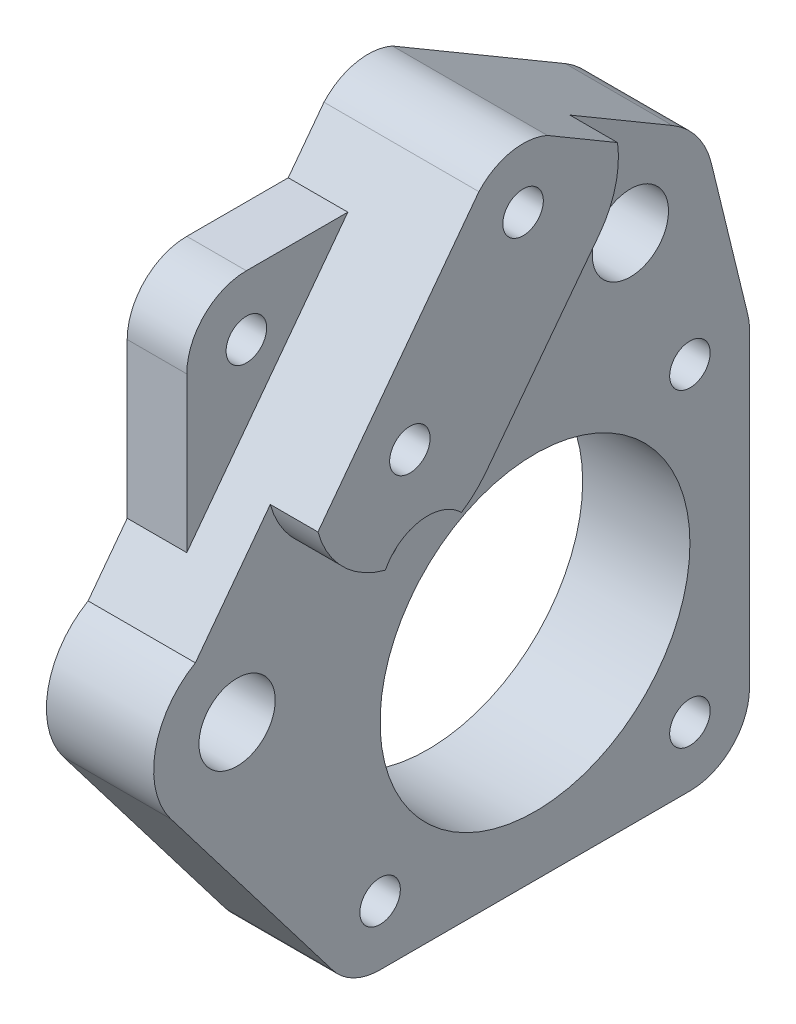
ISO-10303-21;
HEADER;
FILE_DESCRIPTION(('STEP AP214'),'2;1');
FILE_NAME('part.step','',(''),(''),'','','');
FILE_SCHEMA(('AUTOMOTIVE_DESIGN { 1 0 10303 214 1 1 1 1 }'));
ENDSEC;
DATA;
#1=APPLICATION_CONTEXT('core data for automotive mechanical design processes');
#2=APPLICATION_PROTOCOL_DEFINITION('international standard','automotive_design',2000,#1);
#3=PRODUCT_CONTEXT('',#1,'mechanical');
#4=PRODUCT('Part','Part','',(#3));
#5=PRODUCT_RELATED_PRODUCT_CATEGORY('part','',(#4));
#6=PRODUCT_DEFINITION_FORMATION('','',#4);
#7=PRODUCT_DEFINITION_CONTEXT('part definition',#1,'design');
#8=PRODUCT_DEFINITION('design','',#6,#7);
#9=PRODUCT_DEFINITION_SHAPE('','',#8);
#10=(LENGTH_UNIT() NAMED_UNIT(*) SI_UNIT(.MILLI.,.METRE.));
#11=(NAMED_UNIT(*) PLANE_ANGLE_UNIT() SI_UNIT($,.RADIAN.));
#12=(NAMED_UNIT(*) SI_UNIT($,.STERADIAN.) SOLID_ANGLE_UNIT());
#13=UNCERTAINTY_MEASURE_WITH_UNIT(LENGTH_MEASURE(1.E-05),#10,'distance_accuracy_value','');
#14=(GEOMETRIC_REPRESENTATION_CONTEXT(3) GLOBAL_UNCERTAINTY_ASSIGNED_CONTEXT((#13)) GLOBAL_UNIT_ASSIGNED_CONTEXT((#10,
#11,#12)) REPRESENTATION_CONTEXT('',''));
#15=CARTESIAN_POINT('',(0.,0.,0.));
#16=DIRECTION('',(0.,0.,1.));
#17=DIRECTION('',(1.,0.,0.));
#18=AXIS2_PLACEMENT_3D('',#15,#16,#17);
#19=CARTESIAN_POINT('',(4.,-2.49999999998229,22.4999999999866));
#20=DIRECTION('',(-1.,0.,0.));
#21=DIRECTION('',(0.,0.,1.));
#22=AXIS2_PLACEMENT_3D('',#19,#20,#21);
#23=CYLINDRICAL_SURFACE('',#22,8.);
#24=CARTESIAN_POINT('',(0.,-2.49999999998229,22.4999999999866));
#25=DIRECTION('',(1.,0.,0.));
#26=DIRECTION('',(0.,0.,1.));
#27=AXIS2_PLACEMENT_3D('',#24,#25,#26);
#28=CIRCLE('',#27,8.);
#29=CARTESIAN_POINT('',(0.,-4.62238909359415,30.2133303141452));
#30=VERTEX_POINT('',#29);
#31=CARTESIAN_POINT('',(0.,-10.2300450915513,24.5606801989284));
#32=VERTEX_POINT('',#31);
#33=EDGE_CURVE('E253',#30,#32,#28,.T.);
#34=ORIENTED_EDGE('',*,*,#33,.T.);
#35=DIRECTION('',(1.,0.,0.));
#36=VECTOR('',#35,1.);
#37=CARTESIAN_POINT('',(0.,-10.2300450915513,24.5606801989284));
#38=LINE('',#37,#36);
#39=CARTESIAN_POINT('',(4.,-10.2300450915513,24.5606801989284));
#40=VERTEX_POINT('',#39);
#41=EDGE_CURVE('E225',#32,#40,#38,.T.);
#42=ORIENTED_EDGE('',*,*,#41,.T.);
#43=CARTESIAN_POINT('',(4.,-2.49999999998229,22.4999999999866));
#44=DIRECTION('',(1.,0.,0.));
#45=DIRECTION('',(0.,0.,1.));
#46=AXIS2_PLACEMENT_3D('',#43,#44,#45);
#47=CIRCLE('',#46,8.);
#48=CARTESIAN_POINT('',(4.,-4.62238909359415,30.2133303141452));
#49=VERTEX_POINT('',#48);
#50=EDGE_CURVE('E232',#49,#40,#47,.T.);
#51=ORIENTED_EDGE('',*,*,#50,.F.);
#52=DIRECTION('',(-1.,0.,0.));
#53=VECTOR('',#52,1.);
#54=CARTESIAN_POINT('',(4.,-4.62238909359415,30.2133303141452));
#55=LINE('',#54,#53);
#56=EDGE_CURVE('E248',#49,#30,#55,.T.);
#57=ORIENTED_EDGE('',*,*,#56,.T.);
#58=EDGE_LOOP('',(#34,#42,#51,#57));
#59=FACE_BOUND('',#58,.T.);
#60=ADVANCED_FACE('F32',(#59),#23,.T.);
#61=CARTESIAN_POINT('',(-9.,10.0000000000001,12.9999999999998));
#62=DIRECTION('',(1.,0.,0.));
#63=DIRECTION('',(0.,0.,-1.));
#64=AXIS2_PLACEMENT_3D('',#61,#62,#63);
#65=CYLINDRICAL_SURFACE('',#64,5.);
#66=DIRECTION('',(1.,0.,0.));
#67=VECTOR('',#66,1.);
#68=CARTESIAN_POINT('',(-9.,13.3545666198458,16.7076788956186));
#69=LINE('',#68,#67);
#70=CARTESIAN_POINT('',(-9.,13.3545666198458,16.7076788956186));
#71=VERTEX_POINT('',#70);
#72=CARTESIAN_POINT('',(4.,13.3545666198458,16.7076788956186));
#73=VERTEX_POINT('',#72);
#74=EDGE_CURVE('E293',#71,#73,#69,.T.);
#75=ORIENTED_EDGE('',*,*,#74,.T.);
#76=CARTESIAN_POINT('',(4.,10.0000000000001,12.9999999999998));
#77=DIRECTION('',(1.,0.,0.));
#78=DIRECTION('',(0.,0.,1.));
#79=AXIS2_PLACEMENT_3D('',#76,#77,#78);
#80=CIRCLE('',#79,5.);
#81=CARTESIAN_POINT('',(4.,14.5649291278001,10.9600436136612));
#82=VERTEX_POINT('',#81);
#83=EDGE_CURVE('E243',#82,#73,#80,.T.);
#84=ORIENTED_EDGE('',*,*,#83,.F.);
#85=DIRECTION('',(1.,0.,0.));
#86=VECTOR('',#85,1.);
#87=CARTESIAN_POINT('',(-9.,14.5649291278001,10.9600436136612));
#88=LINE('',#87,#86);
#89=CARTESIAN_POINT('',(-9.,14.5649291278001,10.9600436136612));
#90=VERTEX_POINT('',#89);
#91=EDGE_CURVE('E312',#90,#82,#88,.T.);
#92=ORIENTED_EDGE('',*,*,#91,.F.);
#93=CARTESIAN_POINT('',(-9.,10.0000000000001,12.9999999999998));
#94=DIRECTION('',(1.,0.,0.));
#95=DIRECTION('',(0.,0.,-1.));
#96=AXIS2_PLACEMENT_3D('',#93,#94,#95);
#97=CIRCLE('',#96,5.);
#98=EDGE_CURVE('E191',#90,#71,#97,.T.);
#99=ORIENTED_EDGE('',*,*,#98,.T.);
#100=EDGE_LOOP('',(#75,#84,#92,#99));
#101=FACE_BOUND('',#100,.T.);
#102=ADVANCED_FACE('F384',(#101),#65,.T.);
#103=CARTESIAN_POINT('',(-9.,4.53429443986421,-6.09888088978499));
#104=DIRECTION('',(0.,0.862023127131016,-0.506868945873847));
#105=DIRECTION('',(0.,0.506868945873847,0.862023127131016));
#106=AXIS2_PLACEMENT_3D('',#103,#104,#105);
#107=PLANE('',#106);
#108=DIRECTION('',(0.,0.506868945873847,0.862023127131016));
#109=VECTOR('',#108,1.);
#110=CARTESIAN_POINT('',(0.,4.53429443986421,-6.09888088978499));
#111=LINE('',#110,#109);
#112=CARTESIAN_POINT('',(0.,6.03416188991709,-3.54808262111693));
#113=VERTEX_POINT('',#112);
#114=CARTESIAN_POINT('',(0.,11.1055628691357,5.07676008552106));
#115=VERTEX_POINT('',#114);
#116=EDGE_CURVE('E309',#113,#115,#111,.T.);
#117=ORIENTED_EDGE('',*,*,#116,.F.);
#118=DIRECTION('',(1.,0.,0.));
#119=VECTOR('',#118,1.);
#120=CARTESIAN_POINT('',(-9.,6.03416188991709,-3.54808262111693));
#121=LINE('',#120,#119);
#122=CARTESIAN_POINT('',(-9.,6.03416188991709,-3.54808262111693));
#123=VERTEX_POINT('',#122);
#124=EDGE_CURVE('E40',#113,#123,#121,.F.);
#125=ORIENTED_EDGE('',*,*,#124,.T.);
#126=DIRECTION('',(0.,0.506868945873847,0.862023127131016));
#127=VECTOR('',#126,1.);
#128=CARTESIAN_POINT('',(-9.,4.53429443986421,-6.09888088978499));
#129=LINE('',#128,#127);
#130=EDGE_CURVE('E297',#123,#90,#129,.T.);
#131=ORIENTED_EDGE('',*,*,#130,.T.);
#132=ORIENTED_EDGE('',*,*,#91,.T.);
#133=DIRECTION('',(0.,0.506868945873847,0.862023127131016));
#134=VECTOR('',#133,1.);
#135=CARTESIAN_POINT('',(4.,14.5649291278001,10.9600436136612));
#136=LINE('',#135,#134);
#137=CARTESIAN_POINT('',(4.,11.1055628691357,5.07676008552106));
#138=VERTEX_POINT('',#137);
#139=EDGE_CURVE('E240',#138,#82,#136,.T.);
#140=ORIENTED_EDGE('',*,*,#139,.F.);
#141=DIRECTION('',(-1.,0.,0.));
#142=VECTOR('',#141,1.);
#143=CARTESIAN_POINT('',(4.,11.1055628691357,5.07676008552106));
#144=LINE('',#143,#142);
#145=EDGE_CURVE('E264',#138,#115,#144,.T.);
#146=ORIENTED_EDGE('',*,*,#145,.T.);
#147=EDGE_LOOP('',(#117,#125,#131,#132,#140,#146));
#148=FACE_BOUND('',#147,.T.);
#149=ADVANCED_FACE('F508',(#148),#107,.T.);
#150=CARTESIAN_POINT('',(-9.,-11.4512819041316,-10.));
#151=DIRECTION('',(0.,0.237082259689985,-0.971489579017856));
#152=DIRECTION('',(0.,0.971489579017856,0.237082259689985));
#153=AXIS2_PLACEMENT_3D('',#150,#151,#152);
#154=PLANE('',#153);
#155=DIRECTION('',(0.,0.971489579017856,0.237082259689985));
#156=VECTOR('',#155,1.);
#157=CARTESIAN_POINT('',(-9.,-11.4512819041316,-10.));
#158=LINE('',#157,#156);
#159=CARTESIAN_POINT('',(-9.,-10.8671475848076,-9.85744789508928));
#160=VERTEX_POINT('',#159);
#161=CARTESIAN_POINT('',(-9.,1.65957581782987,-6.800427053125));
#162=VERTEX_POINT('',#161);
#163=EDGE_CURVE('E371',#160,#162,#158,.T.);
#164=ORIENTED_EDGE('',*,*,#163,.T.);
#165=DIRECTION('',(1.,0.,0.));
#166=VECTOR('',#165,1.);
#167=CARTESIAN_POINT('',(-9.,1.65957581782987,-6.800427053125));
#168=LINE('',#167,#166);
#169=CARTESIAN_POINT('',(0.,1.65957581782987,-6.800427053125));
#170=VERTEX_POINT('',#169);
#171=EDGE_CURVE('E317',#162,#170,#168,.T.);
#172=ORIENTED_EDGE('',*,*,#171,.T.);
#173=DIRECTION('',(0.,0.971489579017856,0.237082259689985));
#174=VECTOR('',#173,1.);
#175=CARTESIAN_POINT('',(0.,-11.4512819041316,-10.));
#176=LINE('',#175,#174);
#177=CARTESIAN_POINT('',(0.,-10.8671475848076,-9.85744789508928));
#178=VERTEX_POINT('',#177);
#179=EDGE_CURVE('E307',#178,#170,#176,.T.);
#180=ORIENTED_EDGE('',*,*,#179,.F.);
#181=DIRECTION('',(1.,0.,0.));
#182=VECTOR('',#181,1.);
#183=CARTESIAN_POINT('',(-9.,-10.8671475848076,-9.85744789508928));
#184=LINE('',#183,#182);
#185=EDGE_CURVE('E345',#178,#160,#184,.F.);
#186=ORIENTED_EDGE('',*,*,#185,.T.);
#187=EDGE_LOOP('',(#164,#172,#180,#186));
#188=FACE_BOUND('',#187,.T.);
#189=ADVANCED_FACE('F473',(#188),#154,.T.);
#190=CARTESIAN_POINT('',(-9.,-43.0525588832575,-10.));
#191=DIRECTION('',(0.,0.,-1.));
#192=DIRECTION('',(-1.,0.,0.));
#193=AXIS2_PLACEMENT_3D('',#190,#191,#192);
#194=PLANE('',#193);
#195=DIRECTION('',(0.,1.,0.));
#196=VECTOR('',#195,1.);
#197=CARTESIAN_POINT('',(-9.,-43.0525588832575,-10.));
#198=LINE('',#197,#196);
#199=CARTESIAN_POINT('',(-9.,-38.0525588832575,-10.));
#200=VERTEX_POINT('',#199);
#201=CARTESIAN_POINT('',(-9.,-12.0525588832575,-10.));
#202=VERTEX_POINT('',#201);
#203=EDGE_CURVE('E372',#200,#202,#198,.T.);
#204=ORIENTED_EDGE('',*,*,#203,.T.);
#205=DIRECTION('',(1.,0.,0.));
#206=VECTOR('',#205,1.);
#207=CARTESIAN_POINT('',(-9.,-12.0525588832575,-10.));
#208=LINE('',#207,#206);
#209=CARTESIAN_POINT('',(0.,-12.0525588832575,-10.));
#210=VERTEX_POINT('',#209);
#211=EDGE_CURVE('E349',#202,#210,#208,.T.);
#212=ORIENTED_EDGE('',*,*,#211,.T.);
#213=DIRECTION('',(0.,1.,0.));
#214=VECTOR('',#213,1.);
#215=CARTESIAN_POINT('',(0.,-43.0525588832575,-10.));
#216=LINE('',#215,#214);
#217=CARTESIAN_POINT('',(0.,-38.0525588832575,-10.));
#218=VERTEX_POINT('',#217);
#219=EDGE_CURVE('E304',#218,#210,#216,.T.);
#220=ORIENTED_EDGE('',*,*,#219,.F.);
#221=DIRECTION('',(1.,0.,0.));
#222=VECTOR('',#221,1.);
#223=CARTESIAN_POINT('',(-9.,-38.0525588832575,-10.));
#224=LINE('',#223,#222);
#225=EDGE_CURVE('E355',#218,#200,#224,.F.);
#226=ORIENTED_EDGE('',*,*,#225,.T.);
#227=EDGE_LOOP('',(#204,#212,#220,#226));
#228=FACE_BOUND('',#227,.T.);
#229=ADVANCED_FACE('F481',(#228),#194,.T.);
#230=CARTESIAN_POINT('',(-9.,-43.0525588832575,23.4721498299046));
#231=DIRECTION('',(0.,-1.,0.));
#232=DIRECTION('',(0.,0.,-1.));
#233=AXIS2_PLACEMENT_3D('',#230,#231,#232);
#234=PLANE('',#233);
#235=DIRECTION('',(0.,0.,-1.));
#236=VECTOR('',#235,1.);
#237=CARTESIAN_POINT('',(0.,-43.0525588832575,23.4721498299046));
#238=LINE('',#237,#236);
#239=CARTESIAN_POINT('',(0.,-43.0525588832575,21.));
#240=VERTEX_POINT('',#239);
#241=CARTESIAN_POINT('',(0.,-43.0525588832575,-5.));
#242=VERTEX_POINT('',#241);
#243=EDGE_CURVE('E302',#240,#242,#238,.T.);
#244=ORIENTED_EDGE('',*,*,#243,.F.);
#245=DIRECTION('',(1.,0.,0.));
#246=VECTOR('',#245,1.);
#247=CARTESIAN_POINT('',(-9.,-43.0525588832575,21.));
#248=LINE('',#247,#246);
#249=CARTESIAN_POINT('',(-9.,-43.0525588832575,21.));
#250=VERTEX_POINT('',#249);
#251=EDGE_CURVE('E325',#240,#250,#248,.F.);
#252=ORIENTED_EDGE('',*,*,#251,.T.);
#253=DIRECTION('',(0.,0.,-1.));
#254=VECTOR('',#253,1.);
#255=CARTESIAN_POINT('',(-9.,-43.0525588832575,23.4721498299046));
#256=LINE('',#255,#254);
#257=CARTESIAN_POINT('',(-9.,-43.0525588832575,-5.));
#258=VERTEX_POINT('',#257);
#259=EDGE_CURVE('E375',#250,#258,#256,.T.);
#260=ORIENTED_EDGE('',*,*,#259,.T.);
#261=DIRECTION('',(1.,0.,0.));
#262=VECTOR('',#261,1.);
#263=CARTESIAN_POINT('',(-9.,-43.0525588832575,-5.));
#264=LINE('',#263,#262);
#265=EDGE_CURVE('E358',#258,#242,#264,.T.);
#266=ORIENTED_EDGE('',*,*,#265,.T.);
#267=EDGE_LOOP('',(#244,#252,#260,#266));
#268=FACE_BOUND('',#267,.T.);
#269=ADVANCED_FACE('F501',(#268),#234,.T.);
#270=CARTESIAN_POINT('',(-9.,-23.30240929908,38.5622631583856));
#271=DIRECTION('',(0.,-0.607121487974639,0.794609022626512));
#272=DIRECTION('',(0.,-0.794609022626512,-0.607121487974639));
#273=AXIS2_PLACEMENT_3D('',#270,#271,#272);
#274=PLANE('',#273);
#275=DIRECTION('',(0.,-0.794609022626512,-0.607121487974639));
#276=VECTOR('',#275,1.);
#277=CARTESIAN_POINT('',(-9.,-23.30240929908,38.5622631583856));
#278=LINE('',#277,#276);
#279=CARTESIAN_POINT('',(-9.,-23.30240929908,38.5622631583856));
#280=VERTEX_POINT('',#279);
#281=CARTESIAN_POINT('',(-9.,-41.0881663231307,24.9730451131326));
#282=VERTEX_POINT('',#281);
#283=EDGE_CURVE('E379',#280,#282,#278,.T.);
#284=ORIENTED_EDGE('',*,*,#283,.T.);
#285=DIRECTION('',(1.,0.,0.));
#286=VECTOR('',#285,1.);
#287=CARTESIAN_POINT('',(-9.,-41.0881663231307,24.9730451131326));
#288=LINE('',#287,#286);
#289=CARTESIAN_POINT('',(0.,-41.0881663231307,24.9730451131326));
#290=VERTEX_POINT('',#289);
#291=EDGE_CURVE('E333',#282,#290,#288,.T.);
#292=ORIENTED_EDGE('',*,*,#291,.T.);
#293=DIRECTION('',(0.,-0.794609022626512,-0.607121487974639));
#294=VECTOR('',#293,1.);
#295=CARTESIAN_POINT('',(0.,-23.30240929908,38.5622631583856));
#296=LINE('',#295,#294);
#297=CARTESIAN_POINT('',(0.,-23.30240929908,38.5622631583856));
#298=VERTEX_POINT('',#297);
#299=EDGE_CURVE('E288',#298,#290,#296,.T.);
#300=ORIENTED_EDGE('',*,*,#299,.F.);
#301=DIRECTION('',(1.,0.,0.));
#302=VECTOR('',#301,1.);
#303=CARTESIAN_POINT('',(-9.,-23.30240929908,38.5622631583856));
#304=LINE('',#303,#302);
#305=EDGE_CURVE('E363',#280,#298,#304,.T.);
#306=ORIENTED_EDGE('',*,*,#305,.F.);
#307=EDGE_LOOP('',(#284,#292,#300,#306));
#308=FACE_BOUND('',#307,.T.);
#309=ADVANCED_FACE('F492',(#308),#274,.T.);
#310=CARTESIAN_POINT('',(-9.,-19.0525588832575,33.));
#311=DIRECTION('',(1.,0.,0.));
#312=DIRECTION('',(0.,0.,-1.));
#313=AXIS2_PLACEMENT_3D('',#310,#311,#312);
#314=CYLINDRICAL_SURFACE('',#313,7.);
#315=CARTESIAN_POINT('',(0.,-19.0525588832575,33.));
#316=DIRECTION('',(1.,0.,0.));
#317=DIRECTION('',(0.,0.,-1.));
#318=AXIS2_PLACEMENT_3D('',#315,#316,#317);
#319=CIRCLE('',#318,7.);
#320=CARTESIAN_POINT('',(0.,-12.9903810567664,36.5));
#321=VERTEX_POINT('',#320);
#322=EDGE_CURVE('E286',#321,#298,#319,.T.);
#323=ORIENTED_EDGE('',*,*,#322,.F.);
#324=DIRECTION('',(1.,0.,0.));
#325=VECTOR('',#324,1.);
#326=CARTESIAN_POINT('',(-9.,-12.9903810567664,36.5));
#327=LINE('',#326,#325);
#328=CARTESIAN_POINT('',(-9.,-12.9903810567664,36.5));
#329=VERTEX_POINT('',#328);
#330=EDGE_CURVE('E283',#329,#321,#327,.T.);
#331=ORIENTED_EDGE('',*,*,#330,.F.);
#332=CARTESIAN_POINT('',(-9.,-19.0525588832575,33.));
#333=DIRECTION('',(1.,0.,0.));
#334=DIRECTION('',(0.,0.,-1.));
#335=AXIS2_PLACEMENT_3D('',#332,#333,#334);
#336=CIRCLE('',#335,7.);
#337=EDGE_CURVE('E186',#329,#280,#336,.T.);
#338=ORIENTED_EDGE('',*,*,#337,.T.);
#339=ORIENTED_EDGE('',*,*,#305,.T.);
#340=EDGE_LOOP('',(#323,#331,#338,#339));
#341=FACE_BOUND('',#340,.T.);
#342=ADVANCED_FACE('F493',(#341),#314,.T.);
#343=CARTESIAN_POINT('',(-9.,13.3545666198458,16.7076788956186));
#344=DIRECTION('',(0.,0.600652599426219,0.799510134271309));
#345=DIRECTION('',(0.,-0.799510134271309,0.600652599426219));
#346=AXIS2_PLACEMENT_3D('',#343,#344,#345);
#347=PLANE('',#346);
#348=DIRECTION('',(-1.,0.,0.));
#349=VECTOR('',#348,1.);
#350=CARTESIAN_POINT('',(-4.,-8.62359022945594,33.2193358168434));
#351=LINE('',#350,#349);
#352=CARTESIAN_POINT('',(-4.,-8.62359022945594,33.2193358168434));
#353=VERTEX_POINT('',#352);
#354=CARTESIAN_POINT('',(-9.,-8.62359022945594,33.2193358168434));
#355=VERTEX_POINT('',#354);
#356=EDGE_CURVE('E194',#353,#355,#351,.T.);
#357=ORIENTED_EDGE('',*,*,#356,.T.);
#358=DIRECTION('',(0.,-0.799510134271309,0.600652599426219));
#359=VECTOR('',#358,1.);
#360=CARTESIAN_POINT('',(-9.,13.3545666198458,16.7076788956186));
#361=LINE('',#360,#359);
#362=EDGE_CURVE('E179',#355,#329,#361,.T.);
#363=ORIENTED_EDGE('',*,*,#362,.T.);
#364=ORIENTED_EDGE('',*,*,#330,.T.);
#365=DIRECTION('',(0.,-0.799510134271309,0.600652599426219));
#366=VECTOR('',#365,1.);
#367=CARTESIAN_POINT('',(0.,13.3545666198458,16.7076788956186));
#368=LINE('',#367,#366);
#369=EDGE_CURVE('E282',#30,#321,#368,.T.);
#370=ORIENTED_EDGE('',*,*,#369,.F.);
#371=ORIENTED_EDGE('',*,*,#56,.F.);
#372=DIRECTION('',(0.,-0.799510134271309,0.600652599426219));
#373=VECTOR('',#372,1.);
#374=CARTESIAN_POINT('',(4.,-4.62238909359415,30.2133303141452));
#375=LINE('',#374,#373);
#376=EDGE_CURVE('E246',#73,#49,#375,.T.);
#377=ORIENTED_EDGE('',*,*,#376,.F.);
#378=ORIENTED_EDGE('',*,*,#74,.F.);
#379=CARTESIAN_POINT('',(-9.,9.36339452560893,19.7061498222513));
#380=VERTEX_POINT('',#379);
#381=EDGE_CURVE('E190',#71,#380,#361,.T.);
#382=ORIENTED_EDGE('',*,*,#381,.T.);
#383=DIRECTION('',(-1.,0.,0.));
#384=VECTOR('',#383,1.);
#385=CARTESIAN_POINT('',(-4.,9.36339452560893,19.7061498222513));
#386=LINE('',#385,#384);
#387=CARTESIAN_POINT('',(-4.,9.36339452560893,19.7061498222513));
#388=VERTEX_POINT('',#387);
#389=EDGE_CURVE('E203',#388,#380,#386,.T.);
#390=ORIENTED_EDGE('',*,*,#389,.F.);
#391=DIRECTION('',(0.,-0.799510134271309,0.600652599426219));
#392=VECTOR('',#391,1.);
#393=CARTESIAN_POINT('',(-4.,9.36339452560893,19.7061498222513));
#394=LINE('',#393,#392);
#395=EDGE_CURVE('E198',#388,#353,#394,.T.);
#396=ORIENTED_EDGE('',*,*,#395,.T.);
#397=EDGE_LOOP('',(#357,#363,#364,#370,#371,#377,#378,#382,#390,#396));
#398=FACE_BOUND('',#397,.T.);
#399=ADVANCED_FACE('F195',(#398),#347,.T.);
#400=CARTESIAN_POINT('',(-9.,10.0000000000001,12.9999999999998));
#401=DIRECTION('',(1.,0.,0.));
#402=DIRECTION('',(0.,0.,-1.));
#403=AXIS2_PLACEMENT_3D('',#400,#401,#402);
#404=PLANE('',#403);
#405=CARTESIAN_POINT('',(-9.00000000000001,-19.0525588832575,33.));
#406=DIRECTION('',(1.,0.,0.));
#407=DIRECTION('',(0.,0.,-1.));
#408=AXIS2_PLACEMENT_3D('',#405,#406,#407);
#409=CIRCLE('',#408,3.20000000000001);
#410=CARTESIAN_POINT('',(-9.00000000000001,-19.0525588832575,29.8));
#411=VERTEX_POINT('',#410);
#412=EDGE_CURVE('E447',#411,#411,#409,.T.);
#413=ORIENTED_EDGE('',*,*,#412,.T.);
#414=EDGE_LOOP('',(#413));
#415=FACE_BOUND('',#414,.T.);
#416=CARTESIAN_POINT('',(-9.00000000000001,0.,0.));
#417=DIRECTION('',(1.,0.,0.));
#418=DIRECTION('',(0.,0.,-1.));
#419=AXIS2_PLACEMENT_3D('',#416,#417,#418);
#420=CIRCLE('',#419,3.20000000000001);
#421=CARTESIAN_POINT('',(-9.00000000000001,0.,-3.20000000000001));
#422=VERTEX_POINT('',#421);
#423=EDGE_CURVE('E441',#422,#422,#420,.T.);
#424=ORIENTED_EDGE('',*,*,#423,.T.);
#425=EDGE_LOOP('',(#424));
#426=FACE_BOUND('',#425,.T.);
#427=CARTESIAN_POINT('',(-9.00000000000001,-12.0525588832575,-5.));
#428=DIRECTION('',(1.,0.,0.));
#429=DIRECTION('',(0.,0.,-1.));
#430=AXIS2_PLACEMENT_3D('',#427,#428,#429);
#431=CIRCLE('',#430,1.70000000000001);
#432=CARTESIAN_POINT('',(-9.00000000000001,-12.0525588832575,-6.70000000000001));
#433=VERTEX_POINT('',#432);
#434=EDGE_CURVE('E435',#433,#433,#431,.T.);
#435=ORIENTED_EDGE('',*,*,#434,.T.);
#436=EDGE_LOOP('',(#435));
#437=FACE_BOUND('',#436,.T.);
#438=CARTESIAN_POINT('',(-9.00000000000001,-12.0525588832575,21.));
#439=DIRECTION('',(1.,0.,0.));
#440=DIRECTION('',(0.,0.,-1.));
#441=AXIS2_PLACEMENT_3D('',#438,#439,#440);
#442=CIRCLE('',#441,1.70000000000001);
#443=CARTESIAN_POINT('',(-9.00000000000001,-12.0525588832575,19.3));
#444=VERTEX_POINT('',#443);
#445=EDGE_CURVE('E429',#444,#444,#442,.T.);
#446=ORIENTED_EDGE('',*,*,#445,.T.);
#447=EDGE_LOOP('',(#446));
#448=FACE_BOUND('',#447,.T.);
#449=CARTESIAN_POINT('',(-9.00000000000001,-38.0525588832575,21.));
#450=DIRECTION('',(1.,0.,0.));
#451=DIRECTION('',(0.,0.,-1.));
#452=AXIS2_PLACEMENT_3D('',#449,#450,#451);
#453=CIRCLE('',#452,1.70000000000001);
#454=CARTESIAN_POINT('',(-9.00000000000001,-38.0525588832575,19.3));
#455=VERTEX_POINT('',#454);
#456=EDGE_CURVE('E423',#455,#455,#453,.T.);
#457=ORIENTED_EDGE('',*,*,#456,.T.);
#458=EDGE_LOOP('',(#457));
#459=FACE_BOUND('',#458,.T.);
#460=CARTESIAN_POINT('',(-9.00000000000001,-38.0525588832575,-5.));
#461=DIRECTION('',(1.,0.,0.));
#462=DIRECTION('',(0.,0.,-1.));
#463=AXIS2_PLACEMENT_3D('',#460,#461,#462);
#464=CIRCLE('',#463,1.70000000000001);
#465=CARTESIAN_POINT('',(-9.00000000000001,-38.0525588832575,-6.70000000000002));
#466=VERTEX_POINT('',#465);
#467=EDGE_CURVE('E417',#466,#466,#464,.T.);
#468=ORIENTED_EDGE('',*,*,#467,.T.);
#469=EDGE_LOOP('',(#468));
#470=FACE_BOUND('',#469,.T.);
#471=CARTESIAN_POINT('',(-9.00000000000001,-25.0525588832575,7.99999999999999));
#472=DIRECTION('',(1.,0.,0.));
#473=DIRECTION('',(0.,0.,-1.));
#474=AXIS2_PLACEMENT_3D('',#471,#472,#473);
#475=CIRCLE('',#474,13.);
#476=CARTESIAN_POINT('',(-9.00000000000001,-25.0525588832575,-5.00000000000002));
#477=VERTEX_POINT('',#476);
#478=EDGE_CURVE('E411',#477,#477,#475,.T.);
#479=ORIENTED_EDGE('',*,*,#478,.T.);
#480=EDGE_LOOP('',(#479));
#481=FACE_BOUND('',#480,.T.);
#482=CARTESIAN_POINT('',(-9.00000000000001,-2.5,22.5000000000001));
#483=DIRECTION('',(1.,0.,0.));
#484=DIRECTION('',(0.,0.,-1.));
#485=AXIS2_PLACEMENT_3D('',#482,#483,#484);
#486=CIRCLE('',#485,1.70000000000001);
#487=CARTESIAN_POINT('',(-9.00000000000001,-2.5,20.8000000000001));
#488=VERTEX_POINT('',#487);
#489=EDGE_CURVE('E405',#488,#488,#486,.T.);
#490=ORIENTED_EDGE('',*,*,#489,.T.);
#491=EDGE_LOOP('',(#490));
#492=FACE_BOUND('',#491,.T.);
#493=CARTESIAN_POINT('',(-9.00000000000001,10.0000000000001,12.9999999999998));
#494=DIRECTION('',(1.,0.,0.));
#495=DIRECTION('',(0.,0.,-1.));
#496=AXIS2_PLACEMENT_3D('',#493,#494,#495);
#497=CIRCLE('',#496,1.70000000000001);
#498=CARTESIAN_POINT('',(-9.00000000000001,10.0000000000001,11.2999999999998));
#499=VERTEX_POINT('',#498);
#500=EDGE_CURVE('E399',#499,#499,#497,.T.);
#501=ORIENTED_EDGE('',*,*,#500,.T.);
#502=EDGE_LOOP('',(#501));
#503=FACE_BOUND('',#502,.T.);
#504=CARTESIAN_POINT('',(-9.,4.36339452560892,28.2193358168434));
#505=DIRECTION('',(-1.,0.,0.));
#506=DIRECTION('',(0.,0.,1.));
#507=AXIS2_PLACEMENT_3D('',#504,#505,#506);
#508=CIRCLE('',#507,1.70000000000001);
#509=CARTESIAN_POINT('',(-9.,4.36339452560892,29.9193358168434));
#510=VERTEX_POINT('',#509);
#511=EDGE_CURVE('E215',#510,#510,#508,.T.);
#512=ORIENTED_EDGE('',*,*,#511,.F.);
#513=EDGE_LOOP('',(#512));
#514=FACE_BOUND('',#513,.T.);
#515=ORIENTED_EDGE('',*,*,#130,.F.);
#516=CARTESIAN_POINT('',(-9.,0.,0.));
#517=DIRECTION('',(1.,0.,0.));
#518=DIRECTION('',(0.,0.,-1.));
#519=AXIS2_PLACEMENT_3D('',#516,#517,#518);
#520=CIRCLE('',#519,7.);
#521=EDGE_CURVE('E11',#123,#162,#520,.F.);
#522=ORIENTED_EDGE('',*,*,#521,.T.);
#523=ORIENTED_EDGE('',*,*,#163,.F.);
#524=CARTESIAN_POINT('',(-9.,-12.0525588832575,-5.));
#525=DIRECTION('',(1.,0.,0.));
#526=DIRECTION('',(0.,0.,-1.));
#527=AXIS2_PLACEMENT_3D('',#524,#525,#526);
#528=CIRCLE('',#527,5.);
#529=EDGE_CURVE('E343',#160,#202,#528,.F.);
#530=ORIENTED_EDGE('',*,*,#529,.T.);
#531=ORIENTED_EDGE('',*,*,#203,.F.);
#532=CARTESIAN_POINT('',(-9.,-38.0525588832575,-5.));
#533=DIRECTION('',(1.,0.,0.));
#534=DIRECTION('',(0.,0.,-1.));
#535=AXIS2_PLACEMENT_3D('',#532,#533,#534);
#536=CIRCLE('',#535,5.);
#537=EDGE_CURVE('E352',#200,#258,#536,.F.);
#538=ORIENTED_EDGE('',*,*,#537,.T.);
#539=ORIENTED_EDGE('',*,*,#259,.F.);
#540=CARTESIAN_POINT('',(-9.,-38.0525588832575,21.));
#541=DIRECTION('',(1.,0.,0.));
#542=DIRECTION('',(0.,0.,-1.));
#543=AXIS2_PLACEMENT_3D('',#540,#541,#542);
#544=CIRCLE('',#543,5.);
#545=EDGE_CURVE('E320',#250,#282,#544,.F.);
#546=ORIENTED_EDGE('',*,*,#545,.T.);
#547=ORIENTED_EDGE('',*,*,#283,.F.);
#548=ORIENTED_EDGE('',*,*,#337,.F.);
#549=ORIENTED_EDGE('',*,*,#362,.F.);
#550=DIRECTION('',(0.,1.,0.));
#551=VECTOR('',#550,1.);
#552=CARTESIAN_POINT('',(-9.,-8.62359022945594,33.2193358168434));
#553=LINE('',#552,#551);
#554=CARTESIAN_POINT('',(-9.,4.36339452560892,33.2193358168434));
#555=VERTEX_POINT('',#554);
#556=EDGE_CURVE('E183',#355,#555,#553,.T.);
#557=ORIENTED_EDGE('',*,*,#556,.T.);
#558=CARTESIAN_POINT('',(-9.,4.36339452560892,28.2193358168434));
#559=DIRECTION('',(1.,0.,0.));
#560=DIRECTION('',(0.,0.,-1.));
#561=AXIS2_PLACEMENT_3D('',#558,#559,#560);
#562=CIRCLE('',#561,5.);
#563=CARTESIAN_POINT('',(-9.,9.36339452560892,28.2193358168434));
#564=VERTEX_POINT('',#563);
#565=EDGE_CURVE('E340',#555,#564,#562,.F.);
#566=ORIENTED_EDGE('',*,*,#565,.T.);
#567=DIRECTION('',(0.,0.,-1.));
#568=VECTOR('',#567,1.);
#569=CARTESIAN_POINT('',(-9.,9.36339452560892,33.2193358168434));
#570=LINE('',#569,#568);
#571=EDGE_CURVE('E209',#564,#380,#570,.T.);
#572=ORIENTED_EDGE('',*,*,#571,.T.);
#573=ORIENTED_EDGE('',*,*,#381,.F.);
#574=ORIENTED_EDGE('',*,*,#98,.F.);
#575=EDGE_LOOP('',(#515,#522,#523,#530,#531,#538,#539,#546,#547,#548,#549,#557,#566,#572,#573,#574));
#576=FACE_BOUND('',#575,.T.);
#577=ADVANCED_FACE('F181',(#415,#426,#437,#448,#459,#470,#481,#492,#503,#514,#576),#404,.F.);
#578=CARTESIAN_POINT('',(0.,10.0000000000001,12.9999999999998));
#579=DIRECTION('',(1.,0.,0.));
#580=DIRECTION('',(0.,0.,-1.));
#581=AXIS2_PLACEMENT_3D('',#578,#579,#580);
#582=PLANE('',#581);
#583=CARTESIAN_POINT('',(0.,-19.0525588832575,33.));
#584=DIRECTION('',(1.,0.,0.));
#585=DIRECTION('',(0.,0.,-1.));
#586=AXIS2_PLACEMENT_3D('',#583,#584,#585);
#587=CIRCLE('',#586,3.20000000000002);
#588=CARTESIAN_POINT('',(0.,-19.0525588832575,29.8));
#589=VERTEX_POINT('',#588);
#590=EDGE_CURVE('E450',#589,#589,#587,.T.);
#591=ORIENTED_EDGE('',*,*,#590,.F.);
#592=EDGE_LOOP('',(#591));
#593=FACE_BOUND('',#592,.T.);
#594=CARTESIAN_POINT('',(0.,0.,0.));
#595=DIRECTION('',(1.,0.,0.));
#596=DIRECTION('',(0.,0.,-1.));
#597=AXIS2_PLACEMENT_3D('',#594,#595,#596);
#598=CIRCLE('',#597,3.20000000000001);
#599=CARTESIAN_POINT('',(0.,0.,-3.20000000000001));
#600=VERTEX_POINT('',#599);
#601=EDGE_CURVE('E444',#600,#600,#598,.T.);
#602=ORIENTED_EDGE('',*,*,#601,.F.);
#603=EDGE_LOOP('',(#602));
#604=FACE_BOUND('',#603,.T.);
#605=CARTESIAN_POINT('',(0.,-12.0525588832575,-5.));
#606=DIRECTION('',(1.,0.,0.));
#607=DIRECTION('',(0.,0.,-1.));
#608=AXIS2_PLACEMENT_3D('',#605,#606,#607);
#609=CIRCLE('',#608,1.70000000000001);
#610=CARTESIAN_POINT('',(0.,-12.0525588832575,-6.70000000000001));
#611=VERTEX_POINT('',#610);
#612=EDGE_CURVE('E438',#611,#611,#609,.T.);
#613=ORIENTED_EDGE('',*,*,#612,.F.);
#614=EDGE_LOOP('',(#613));
#615=FACE_BOUND('',#614,.T.);
#616=CARTESIAN_POINT('',(0.,-12.0525588832575,21.));
#617=DIRECTION('',(1.,0.,0.));
#618=DIRECTION('',(0.,0.,-1.));
#619=AXIS2_PLACEMENT_3D('',#616,#617,#618);
#620=CIRCLE('',#619,1.70000000000001);
#621=CARTESIAN_POINT('',(0.,-12.0525588832575,19.3));
#622=VERTEX_POINT('',#621);
#623=EDGE_CURVE('E432',#622,#622,#620,.T.);
#624=ORIENTED_EDGE('',*,*,#623,.F.);
#625=EDGE_LOOP('',(#624));
#626=FACE_BOUND('',#625,.T.);
#627=CARTESIAN_POINT('',(0.,-38.0525588832575,21.));
#628=DIRECTION('',(1.,0.,0.));
#629=DIRECTION('',(0.,0.,-1.));
#630=AXIS2_PLACEMENT_3D('',#627,#628,#629);
#631=CIRCLE('',#630,1.70000000000001);
#632=CARTESIAN_POINT('',(0.,-38.0525588832575,19.3));
#633=VERTEX_POINT('',#632);
#634=EDGE_CURVE('E426',#633,#633,#631,.T.);
#635=ORIENTED_EDGE('',*,*,#634,.F.);
#636=EDGE_LOOP('',(#635));
#637=FACE_BOUND('',#636,.T.);
#638=CARTESIAN_POINT('',(0.,-38.0525588832575,-5.));
#639=DIRECTION('',(1.,0.,0.));
#640=DIRECTION('',(0.,0.,-1.));
#641=AXIS2_PLACEMENT_3D('',#638,#639,#640);
#642=CIRCLE('',#641,1.70000000000001);
#643=CARTESIAN_POINT('',(0.,-38.0525588832575,-6.70000000000002));
#644=VERTEX_POINT('',#643);
#645=EDGE_CURVE('E420',#644,#644,#642,.T.);
#646=ORIENTED_EDGE('',*,*,#645,.F.);
#647=EDGE_LOOP('',(#646));
#648=FACE_BOUND('',#647,.T.);
#649=CARTESIAN_POINT('',(0.,-25.0525588832575,7.99999999999999));
#650=DIRECTION('',(1.,0.,0.));
#651=DIRECTION('',(0.,0.,-1.));
#652=AXIS2_PLACEMENT_3D('',#649,#650,#651);
#653=CIRCLE('',#652,13.);
#654=CARTESIAN_POINT('',(0.,-25.0525588832575,-5.00000000000002));
#655=VERTEX_POINT('',#654);
#656=EDGE_CURVE('E414',#655,#655,#653,.T.);
#657=ORIENTED_EDGE('',*,*,#656,.F.);
#658=EDGE_LOOP('',(#657));
#659=FACE_BOUND('',#658,.T.);
#660=ORIENTED_EDGE('',*,*,#179,.T.);
#661=CARTESIAN_POINT('',(0.,0.,0.));
#662=DIRECTION('',(1.,0.,0.));
#663=DIRECTION('',(0.,0.,-1.));
#664=AXIS2_PLACEMENT_3D('',#661,#662,#663);
#665=CIRCLE('',#664,7.);
#666=EDGE_CURVE('E54',#170,#113,#665,.T.);
#667=ORIENTED_EDGE('',*,*,#666,.T.);
#668=ORIENTED_EDGE('',*,*,#116,.T.);
#669=CARTESIAN_POINT('',(0.,10.0000000000001,12.9999999999998));
#670=DIRECTION('',(1.,0.,0.));
#671=DIRECTION('',(0.,0.,1.));
#672=AXIS2_PLACEMENT_3D('',#669,#670,#671);
#673=CIRCLE('',#672,8.);
#674=CARTESIAN_POINT('',(0.,5.15933385973157,6.63070244701501));
#675=VERTEX_POINT('',#674);
#676=EDGE_CURVE('E252',#675,#115,#673,.T.);
#677=ORIENTED_EDGE('',*,*,#676,.F.);
#678=DIRECTION('',(0.,0.796162194123095,-0.605083267533568));
#679=VECTOR('',#678,1.);
#680=CARTESIAN_POINT('',(0.,5.15933385973157,6.63070244701501));
#681=LINE('',#680,#679);
#682=CARTESIAN_POINT('',(0.,-7.34066614025084,16.1307024470019));
#683=VERTEX_POINT('',#682);
#684=EDGE_CURVE('E249',#683,#675,#681,.T.);
#685=ORIENTED_EDGE('',*,*,#684,.F.);
#686=CARTESIAN_POINT('',(0.,-9.22642879724545,18.169277700491));
#687=VERTEX_POINT('',#686);
#688=EDGE_CURVE('E229',#687,#683,#28,.T.);
#689=ORIENTED_EDGE('',*,*,#688,.F.);
#690=CARTESIAN_POINT('',(0.,-12.0525588832575,21.));
#691=DIRECTION('',(1.,0.,0.));
#692=DIRECTION('',(0.,0.,-1.));
#693=AXIS2_PLACEMENT_3D('',#690,#691,#692);
#694=CIRCLE('',#693,4.);
#695=EDGE_CURVE('E222',#687,#32,#694,.T.);
#696=ORIENTED_EDGE('',*,*,#695,.T.);
#697=ORIENTED_EDGE('',*,*,#33,.F.);
#698=ORIENTED_EDGE('',*,*,#369,.T.);
#699=ORIENTED_EDGE('',*,*,#322,.T.);
#700=ORIENTED_EDGE('',*,*,#299,.T.);
#701=CARTESIAN_POINT('',(0.,-38.0525588832575,21.));
#702=DIRECTION('',(1.,0.,0.));
#703=DIRECTION('',(0.,0.,-1.));
#704=AXIS2_PLACEMENT_3D('',#701,#702,#703);
#705=CIRCLE('',#704,5.);
#706=EDGE_CURVE('E329',#290,#240,#705,.T.);
#707=ORIENTED_EDGE('',*,*,#706,.T.);
#708=ORIENTED_EDGE('',*,*,#243,.T.);
#709=CARTESIAN_POINT('',(0.,-38.0525588832575,-5.));
#710=DIRECTION('',(1.,0.,0.));
#711=DIRECTION('',(0.,0.,-1.));
#712=AXIS2_PLACEMENT_3D('',#709,#710,#711);
#713=CIRCLE('',#712,5.);
#714=EDGE_CURVE('E357',#242,#218,#713,.T.);
#715=ORIENTED_EDGE('',*,*,#714,.T.);
#716=ORIENTED_EDGE('',*,*,#219,.T.);
#717=CARTESIAN_POINT('',(0.,-12.0525588832575,-5.));
#718=DIRECTION('',(1.,0.,0.));
#719=DIRECTION('',(0.,0.,-1.));
#720=AXIS2_PLACEMENT_3D('',#717,#718,#719);
#721=CIRCLE('',#720,5.);
#722=EDGE_CURVE('E347',#210,#178,#721,.T.);
#723=ORIENTED_EDGE('',*,*,#722,.T.);
#724=EDGE_LOOP('',(#660,#667,#668,#677,#685,#689,#696,#697,#698,#699,#700,#707,#708,#715,#716,#723));
#725=FACE_BOUND('',#724,.T.);
#726=ADVANCED_FACE('F456',(#593,#604,#615,#626,#637,#648,#659,#725),#582,.T.);
#727=CARTESIAN_POINT('',(4.,-9.22642879724545,18.169277700491));
#728=VERTEX_POINT('',#727);
#729=CARTESIAN_POINT('',(4.,-7.34066614025084,16.1307024470019));
#730=VERTEX_POINT('',#729);
#731=EDGE_CURVE('E236',#728,#730,#47,.T.);
#732=ORIENTED_EDGE('',*,*,#731,.F.);
#733=DIRECTION('',(1.,0.,0.));
#734=VECTOR('',#733,1.);
#735=CARTESIAN_POINT('',(0.,-9.22642879724545,18.169277700491));
#736=LINE('',#735,#734);
#737=EDGE_CURVE('E227',#687,#728,#736,.T.);
#738=ORIENTED_EDGE('',*,*,#737,.F.);
#739=ORIENTED_EDGE('',*,*,#688,.T.);
#740=DIRECTION('',(-1.,0.,0.));
#741=VECTOR('',#740,1.);
#742=CARTESIAN_POINT('',(4.,-7.34066614025084,16.1307024470019));
#743=LINE('',#742,#741);
#744=EDGE_CURVE('E287',#730,#683,#743,.T.);
#745=ORIENTED_EDGE('',*,*,#744,.F.);
#746=EDGE_LOOP('',(#732,#738,#739,#745));
#747=FACE_BOUND('',#746,.T.);
#748=ADVANCED_FACE('F459',(#747),#23,.T.);
#749=CARTESIAN_POINT('',(4.,5.15933385973157,6.63070244701501));
#750=DIRECTION('',(0.,0.605083267533568,0.796162194123095));
#751=DIRECTION('',(0.,-0.796162194123095,0.605083267533568));
#752=AXIS2_PLACEMENT_3D('',#749,#750,#751);
#753=PLANE('',#752);
#754=ORIENTED_EDGE('',*,*,#684,.T.);
#755=DIRECTION('',(-1.,0.,0.));
#756=VECTOR('',#755,1.);
#757=CARTESIAN_POINT('',(4.,5.15933385973157,6.63070244701501));
#758=LINE('',#757,#756);
#759=CARTESIAN_POINT('',(4.,5.15933385973157,6.63070244701501));
#760=VERTEX_POINT('',#759);
#761=EDGE_CURVE('E256',#760,#675,#758,.T.);
#762=ORIENTED_EDGE('',*,*,#761,.F.);
#763=DIRECTION('',(0.,0.796162194123095,-0.605083267533568));
#764=VECTOR('',#763,1.);
#765=CARTESIAN_POINT('',(4.,5.15933385973157,6.63070244701501));
#766=LINE('',#765,#764);
#767=EDGE_CURVE('E235',#730,#760,#766,.T.);
#768=ORIENTED_EDGE('',*,*,#767,.F.);
#769=ORIENTED_EDGE('',*,*,#744,.T.);
#770=EDGE_LOOP('',(#754,#762,#768,#769));
#771=FACE_BOUND('',#770,.T.);
#772=ADVANCED_FACE('F513',(#771),#753,.F.);
#773=CARTESIAN_POINT('',(4.,10.0000000000001,12.9999999999998));
#774=DIRECTION('',(-1.,0.,0.));
#775=DIRECTION('',(0.,0.,1.));
#776=AXIS2_PLACEMENT_3D('',#773,#774,#775);
#777=CYLINDRICAL_SURFACE('',#776,8.);
#778=ORIENTED_EDGE('',*,*,#676,.T.);
#779=ORIENTED_EDGE('',*,*,#145,.F.);
#780=CARTESIAN_POINT('',(4.,10.0000000000001,12.9999999999998));
#781=DIRECTION('',(1.,0.,0.));
#782=DIRECTION('',(0.,0.,1.));
#783=AXIS2_PLACEMENT_3D('',#780,#781,#782);
#784=CIRCLE('',#783,8.);
#785=EDGE_CURVE('E238',#760,#138,#784,.T.);
#786=ORIENTED_EDGE('',*,*,#785,.F.);
#787=ORIENTED_EDGE('',*,*,#761,.T.);
#788=EDGE_LOOP('',(#778,#779,#786,#787));
#789=FACE_BOUND('',#788,.T.);
#790=ADVANCED_FACE('F518',(#789),#777,.T.);
#791=CARTESIAN_POINT('',(4.,-2.49999999998229,22.4999999999866));
#792=DIRECTION('',(-1.,0.,0.));
#793=DIRECTION('',(0.,0.,1.));
#794=AXIS2_PLACEMENT_3D('',#791,#792,#793);
#795=PLANE('',#794);
#796=CARTESIAN_POINT('',(4.,-2.5,22.5000000000001));
#797=DIRECTION('',(1.,0.,0.));
#798=DIRECTION('',(0.,0.,-1.));
#799=AXIS2_PLACEMENT_3D('',#796,#797,#798);
#800=CIRCLE('',#799,1.70000000000001);
#801=CARTESIAN_POINT('',(4.,-2.5,20.8000000000001));
#802=VERTEX_POINT('',#801);
#803=EDGE_CURVE('E408',#802,#802,#800,.T.);
#804=ORIENTED_EDGE('',*,*,#803,.F.);
#805=EDGE_LOOP('',(#804));
#806=FACE_BOUND('',#805,.T.);
#807=CARTESIAN_POINT('',(4.,10.0000000000001,12.9999999999998));
#808=DIRECTION('',(1.,0.,0.));
#809=DIRECTION('',(0.,0.,-1.));
#810=AXIS2_PLACEMENT_3D('',#807,#808,#809);
#811=CIRCLE('',#810,1.70000000000001);
#812=CARTESIAN_POINT('',(4.,10.0000000000001,11.2999999999998));
#813=VERTEX_POINT('',#812);
#814=EDGE_CURVE('E402',#813,#813,#811,.T.);
#815=ORIENTED_EDGE('',*,*,#814,.F.);
#816=EDGE_LOOP('',(#815));
#817=FACE_BOUND('',#816,.T.);
#818=ORIENTED_EDGE('',*,*,#50,.T.);
#819=CARTESIAN_POINT('',(4.,-12.0525588832575,21.));
#820=DIRECTION('',(1.,0.,0.));
#821=DIRECTION('',(0.,0.,-1.));
#822=AXIS2_PLACEMENT_3D('',#819,#820,#821);
#823=CIRCLE('',#822,4.);
#824=EDGE_CURVE('E202',#728,#40,#823,.T.);
#825=ORIENTED_EDGE('',*,*,#824,.F.);
#826=ORIENTED_EDGE('',*,*,#731,.T.);
#827=ORIENTED_EDGE('',*,*,#767,.T.);
#828=ORIENTED_EDGE('',*,*,#785,.T.);
#829=ORIENTED_EDGE('',*,*,#139,.T.);
#830=ORIENTED_EDGE('',*,*,#83,.T.);
#831=ORIENTED_EDGE('',*,*,#376,.T.);
#832=EDGE_LOOP('',(#818,#825,#826,#827,#828,#829,#830,#831));
#833=FACE_BOUND('',#832,.T.);
#834=ADVANCED_FACE('F527',(#806,#817,#833),#795,.F.);
#835=CARTESIAN_POINT('',(0.,-12.0525588832575,21.));
#836=DIRECTION('',(1.,0.,0.));
#837=DIRECTION('',(0.,0.,-1.));
#838=AXIS2_PLACEMENT_3D('',#835,#836,#837);
#839=CYLINDRICAL_SURFACE('',#838,4.);
#840=ORIENTED_EDGE('',*,*,#824,.T.);
#841=ORIENTED_EDGE('',*,*,#41,.F.);
#842=ORIENTED_EDGE('',*,*,#695,.F.);
#843=ORIENTED_EDGE('',*,*,#737,.T.);
#844=EDGE_LOOP('',(#840,#841,#842,#843));
#845=FACE_BOUND('',#844,.T.);
#846=ADVANCED_FACE('F602',(#845),#839,.F.);
#847=CARTESIAN_POINT('',(-4.,-8.62359022945594,33.2193358168434));
#848=DIRECTION('',(0.,0.,1.));
#849=DIRECTION('',(0.,-1.,0.));
#850=AXIS2_PLACEMENT_3D('',#847,#848,#849);
#851=PLANE('',#850);
#852=DIRECTION('',(0.,1.,0.));
#853=VECTOR('',#852,1.);
#854=CARTESIAN_POINT('',(-4.,-8.62359022945594,33.2193358168434));
#855=LINE('',#854,#853);
#856=CARTESIAN_POINT('',(-4.,4.36339452560892,33.2193358168434));
#857=VERTEX_POINT('',#856);
#858=EDGE_CURVE('E212',#353,#857,#855,.T.);
#859=ORIENTED_EDGE('',*,*,#858,.T.);
#860=DIRECTION('',(-1.,0.,0.));
#861=VECTOR('',#860,1.);
#862=CARTESIAN_POINT('',(-4.,4.36339452560892,33.2193358168434));
#863=LINE('',#862,#861);
#864=EDGE_CURVE('E208',#857,#555,#863,.T.);
#865=ORIENTED_EDGE('',*,*,#864,.T.);
#866=ORIENTED_EDGE('',*,*,#556,.F.);
#867=ORIENTED_EDGE('',*,*,#356,.F.);
#868=EDGE_LOOP('',(#859,#865,#866,#867));
#869=FACE_BOUND('',#868,.T.);
#870=ADVANCED_FACE('F206',(#869),#851,.T.);
#871=CARTESIAN_POINT('',(-4.,9.36339452560892,33.2193358168434));
#872=DIRECTION('',(0.,1.,0.));
#873=DIRECTION('',(0.,0.,1.));
#874=AXIS2_PLACEMENT_3D('',#871,#872,#873);
#875=PLANE('',#874);
#876=ORIENTED_EDGE('',*,*,#571,.F.);
#877=DIRECTION('',(-1.,0.,0.));
#878=VECTOR('',#877,1.);
#879=CARTESIAN_POINT('',(-4.,9.36339452560892,28.2193358168434));
#880=LINE('',#879,#878);
#881=CARTESIAN_POINT('',(-4.,9.36339452560892,28.2193358168434));
#882=VERTEX_POINT('',#881);
#883=EDGE_CURVE('E338',#564,#882,#880,.F.);
#884=ORIENTED_EDGE('',*,*,#883,.T.);
#885=DIRECTION('',(0.,0.,-1.));
#886=VECTOR('',#885,1.);
#887=CARTESIAN_POINT('',(-4.,9.36339452560892,33.2193358168434));
#888=LINE('',#887,#886);
#889=EDGE_CURVE('E392',#882,#388,#888,.T.);
#890=ORIENTED_EDGE('',*,*,#889,.T.);
#891=ORIENTED_EDGE('',*,*,#389,.T.);
#892=EDGE_LOOP('',(#876,#884,#890,#891));
#893=FACE_BOUND('',#892,.T.);
#894=ADVANCED_FACE('F389',(#893),#875,.T.);
#895=CARTESIAN_POINT('',(-4.,9.36339452560892,33.2193358168434));
#896=DIRECTION('',(-1.,0.,0.));
#897=DIRECTION('',(0.,0.,1.));
#898=AXIS2_PLACEMENT_3D('',#895,#896,#897);
#899=PLANE('',#898);
#900=CARTESIAN_POINT('',(-4.,4.36339452560892,28.2193358168434));
#901=DIRECTION('',(-1.,0.,0.));
#902=DIRECTION('',(0.,0.,1.));
#903=AXIS2_PLACEMENT_3D('',#900,#901,#902);
#904=CIRCLE('',#903,1.70000000000001);
#905=CARTESIAN_POINT('',(-4.,4.36339452560892,29.9193358168434));
#906=VERTEX_POINT('',#905);
#907=EDGE_CURVE('E210',#906,#906,#904,.T.);
#908=ORIENTED_EDGE('',*,*,#907,.T.);
#909=EDGE_LOOP('',(#908));
#910=FACE_BOUND('',#909,.T.);
#911=ORIENTED_EDGE('',*,*,#889,.F.);
#912=CARTESIAN_POINT('',(-4.,4.36339452560892,28.2193358168434));
#913=DIRECTION('',(-1.,0.,0.));
#914=DIRECTION('',(0.,0.,1.));
#915=AXIS2_PLACEMENT_3D('',#912,#913,#914);
#916=CIRCLE('',#915,5.);
#917=EDGE_CURVE('E336',#882,#857,#916,.F.);
#918=ORIENTED_EDGE('',*,*,#917,.T.);
#919=ORIENTED_EDGE('',*,*,#858,.F.);
#920=ORIENTED_EDGE('',*,*,#395,.F.);
#921=EDGE_LOOP('',(#911,#918,#919,#920));
#922=FACE_BOUND('',#921,.T.);
#923=ADVANCED_FACE('F593',(#910,#922),#899,.F.);
#924=CARTESIAN_POINT('',(-9.,4.36339452560892,28.2193358168434));
#925=DIRECTION('',(-1.,0.,0.));
#926=DIRECTION('',(0.,0.,1.));
#927=AXIS2_PLACEMENT_3D('',#924,#925,#926);
#928=CYLINDRICAL_SURFACE('',#927,1.70000000000001);
#929=ORIENTED_EDGE('',*,*,#511,.T.);
#930=EDGE_LOOP('',(#929));
#931=FACE_BOUND('',#930,.T.);
#932=ORIENTED_EDGE('',*,*,#907,.F.);
#933=EDGE_LOOP('',(#932));
#934=FACE_BOUND('',#933,.T.);
#935=ADVANCED_FACE('F589',(#931,#934),#928,.F.);
#936=CARTESIAN_POINT('',(4.,10.0000000000001,12.9999999999998));
#937=DIRECTION('',(1.,0.,0.));
#938=DIRECTION('',(0.,0.,-1.));
#939=AXIS2_PLACEMENT_3D('',#936,#937,#938);
#940=CYLINDRICAL_SURFACE('',#939,1.70000000000001);
#941=ORIENTED_EDGE('',*,*,#500,.F.);
#942=EDGE_LOOP('',(#941));
#943=FACE_BOUND('',#942,.T.);
#944=ORIENTED_EDGE('',*,*,#814,.T.);
#945=EDGE_LOOP('',(#944));
#946=FACE_BOUND('',#945,.T.);
#947=ADVANCED_FACE('F585',(#943,#946),#940,.F.);
#948=CARTESIAN_POINT('',(4.,-2.5,22.5000000000001));
#949=DIRECTION('',(1.,0.,0.));
#950=DIRECTION('',(0.,0.,-1.));
#951=AXIS2_PLACEMENT_3D('',#948,#949,#950);
#952=CYLINDRICAL_SURFACE('',#951,1.70000000000001);
#953=ORIENTED_EDGE('',*,*,#489,.F.);
#954=EDGE_LOOP('',(#953));
#955=FACE_BOUND('',#954,.T.);
#956=ORIENTED_EDGE('',*,*,#803,.T.);
#957=EDGE_LOOP('',(#956));
#958=FACE_BOUND('',#957,.T.);
#959=ADVANCED_FACE('F581',(#955,#958),#952,.F.);
#960=CARTESIAN_POINT('',(0.,-25.0525588832575,7.99999999999999));
#961=DIRECTION('',(1.,0.,0.));
#962=DIRECTION('',(0.,0.,-1.));
#963=AXIS2_PLACEMENT_3D('',#960,#961,#962);
#964=CYLINDRICAL_SURFACE('',#963,13.);
#965=ORIENTED_EDGE('',*,*,#478,.F.);
#966=EDGE_LOOP('',(#965));
#967=FACE_BOUND('',#966,.T.);
#968=ORIENTED_EDGE('',*,*,#656,.T.);
#969=EDGE_LOOP('',(#968));
#970=FACE_BOUND('',#969,.T.);
#971=ADVANCED_FACE('F577',(#967,#970),#964,.F.);
#972=CARTESIAN_POINT('',(0.,-38.0525588832575,-5.));
#973=DIRECTION('',(1.,0.,0.));
#974=DIRECTION('',(0.,0.,-1.));
#975=AXIS2_PLACEMENT_3D('',#972,#973,#974);
#976=CYLINDRICAL_SURFACE('',#975,1.70000000000001);
#977=ORIENTED_EDGE('',*,*,#467,.F.);
#978=EDGE_LOOP('',(#977));
#979=FACE_BOUND('',#978,.T.);
#980=ORIENTED_EDGE('',*,*,#645,.T.);
#981=EDGE_LOOP('',(#980));
#982=FACE_BOUND('',#981,.T.);
#983=ADVANCED_FACE('F573',(#979,#982),#976,.F.);
#984=CARTESIAN_POINT('',(0.,-38.0525588832575,21.));
#985=DIRECTION('',(1.,0.,0.));
#986=DIRECTION('',(0.,0.,-1.));
#987=AXIS2_PLACEMENT_3D('',#984,#985,#986);
#988=CYLINDRICAL_SURFACE('',#987,1.70000000000001);
#989=ORIENTED_EDGE('',*,*,#456,.F.);
#990=EDGE_LOOP('',(#989));
#991=FACE_BOUND('',#990,.T.);
#992=ORIENTED_EDGE('',*,*,#634,.T.);
#993=EDGE_LOOP('',(#992));
#994=FACE_BOUND('',#993,.T.);
#995=ADVANCED_FACE('F569',(#991,#994),#988,.F.);
#996=CARTESIAN_POINT('',(0.,-12.0525588832575,21.));
#997=DIRECTION('',(1.,0.,0.));
#998=DIRECTION('',(0.,0.,-1.));
#999=AXIS2_PLACEMENT_3D('',#996,#997,#998);
#1000=CYLINDRICAL_SURFACE('',#999,1.70000000000001);
#1001=ORIENTED_EDGE('',*,*,#445,.F.);
#1002=EDGE_LOOP('',(#1001));
#1003=FACE_BOUND('',#1002,.T.);
#1004=ORIENTED_EDGE('',*,*,#623,.T.);
#1005=EDGE_LOOP('',(#1004));
#1006=FACE_BOUND('',#1005,.T.);
#1007=ADVANCED_FACE('F565',(#1003,#1006),#1000,.F.);
#1008=CARTESIAN_POINT('',(0.,-12.0525588832575,-5.));
#1009=DIRECTION('',(1.,0.,0.));
#1010=DIRECTION('',(0.,0.,-1.));
#1011=AXIS2_PLACEMENT_3D('',#1008,#1009,#1010);
#1012=CYLINDRICAL_SURFACE('',#1011,1.70000000000001);
#1013=ORIENTED_EDGE('',*,*,#434,.F.);
#1014=EDGE_LOOP('',(#1013));
#1015=FACE_BOUND('',#1014,.T.);
#1016=ORIENTED_EDGE('',*,*,#612,.T.);
#1017=EDGE_LOOP('',(#1016));
#1018=FACE_BOUND('',#1017,.T.);
#1019=ADVANCED_FACE('F558',(#1015,#1018),#1012,.F.);
#1020=CARTESIAN_POINT('',(0.,0.,0.));
#1021=DIRECTION('',(1.,0.,0.));
#1022=DIRECTION('',(0.,0.,-1.));
#1023=AXIS2_PLACEMENT_3D('',#1020,#1021,#1022);
#1024=CYLINDRICAL_SURFACE('',#1023,3.20000000000001);
#1025=ORIENTED_EDGE('',*,*,#423,.F.);
#1026=EDGE_LOOP('',(#1025));
#1027=FACE_BOUND('',#1026,.T.);
#1028=ORIENTED_EDGE('',*,*,#601,.T.);
#1029=EDGE_LOOP('',(#1028));
#1030=FACE_BOUND('',#1029,.T.);
#1031=ADVANCED_FACE('F552',(#1027,#1030),#1024,.F.);
#1032=CARTESIAN_POINT('',(0.,-19.0525588832575,33.));
#1033=DIRECTION('',(1.,0.,0.));
#1034=DIRECTION('',(0.,0.,-1.));
#1035=AXIS2_PLACEMENT_3D('',#1032,#1033,#1034);
#1036=CYLINDRICAL_SURFACE('',#1035,3.20000000000001);
#1037=ORIENTED_EDGE('',*,*,#412,.F.);
#1038=EDGE_LOOP('',(#1037));
#1039=FACE_BOUND('',#1038,.T.);
#1040=ORIENTED_EDGE('',*,*,#590,.T.);
#1041=EDGE_LOOP('',(#1040));
#1042=FACE_BOUND('',#1041,.T.);
#1043=ADVANCED_FACE('F454',(#1039,#1042),#1036,.F.);
#1044=CARTESIAN_POINT('',(-9.,-38.0525588832575,-5.));
#1045=DIRECTION('',(1.,0.,0.));
#1046=DIRECTION('',(0.,0.,-1.));
#1047=AXIS2_PLACEMENT_3D('',#1044,#1045,#1046);
#1048=CYLINDRICAL_SURFACE('',#1047,5.);
#1049=ORIENTED_EDGE('',*,*,#537,.F.);
#1050=ORIENTED_EDGE('',*,*,#225,.F.);
#1051=ORIENTED_EDGE('',*,*,#714,.F.);
#1052=ORIENTED_EDGE('',*,*,#265,.F.);
#1053=EDGE_LOOP('',(#1049,#1050,#1051,#1052));
#1054=FACE_BOUND('',#1053,.T.);
#1055=ADVANCED_FACE('F486',(#1054),#1048,.T.);
#1056=CARTESIAN_POINT('',(-9.,-12.0525588832575,-5.));
#1057=DIRECTION('',(1.,0.,0.));
#1058=DIRECTION('',(0.,0.,-1.));
#1059=AXIS2_PLACEMENT_3D('',#1056,#1057,#1058);
#1060=CYLINDRICAL_SURFACE('',#1059,5.);
#1061=ORIENTED_EDGE('',*,*,#529,.F.);
#1062=ORIENTED_EDGE('',*,*,#185,.F.);
#1063=ORIENTED_EDGE('',*,*,#722,.F.);
#1064=ORIENTED_EDGE('',*,*,#211,.F.);
#1065=EDGE_LOOP('',(#1061,#1062,#1063,#1064));
#1066=FACE_BOUND('',#1065,.T.);
#1067=ADVANCED_FACE('F476',(#1066),#1060,.T.);
#1068=CARTESIAN_POINT('',(-4.,4.36339452560892,28.2193358168434));
#1069=DIRECTION('',(-1.,0.,0.));
#1070=DIRECTION('',(0.,-1.,0.));
#1071=AXIS2_PLACEMENT_3D('',#1068,#1069,#1070);
#1072=CYLINDRICAL_SURFACE('',#1071,5.);
#1073=ORIENTED_EDGE('',*,*,#917,.F.);
#1074=ORIENTED_EDGE('',*,*,#883,.F.);
#1075=ORIENTED_EDGE('',*,*,#565,.F.);
#1076=ORIENTED_EDGE('',*,*,#864,.F.);
#1077=EDGE_LOOP('',(#1073,#1074,#1075,#1076));
#1078=FACE_BOUND('',#1077,.T.);
#1079=ADVANCED_FACE('F539',(#1078),#1072,.T.);
#1080=CARTESIAN_POINT('',(-9.,-38.0525588832575,21.));
#1081=DIRECTION('',(1.,0.,0.));
#1082=DIRECTION('',(0.,0.,-1.));
#1083=AXIS2_PLACEMENT_3D('',#1080,#1081,#1082);
#1084=CYLINDRICAL_SURFACE('',#1083,5.);
#1085=ORIENTED_EDGE('',*,*,#545,.F.);
#1086=ORIENTED_EDGE('',*,*,#251,.F.);
#1087=ORIENTED_EDGE('',*,*,#706,.F.);
#1088=ORIENTED_EDGE('',*,*,#291,.F.);
#1089=EDGE_LOOP('',(#1085,#1086,#1087,#1088));
#1090=FACE_BOUND('',#1089,.T.);
#1091=ADVANCED_FACE('F490',(#1090),#1084,.T.);
#1092=CARTESIAN_POINT('',(-9.,0.,0.));
#1093=DIRECTION('',(1.,0.,0.));
#1094=DIRECTION('',(0.,0.,-1.));
#1095=AXIS2_PLACEMENT_3D('',#1092,#1093,#1094);
#1096=CYLINDRICAL_SURFACE('',#1095,7.);
#1097=ORIENTED_EDGE('',*,*,#521,.F.);
#1098=ORIENTED_EDGE('',*,*,#124,.F.);
#1099=ORIENTED_EDGE('',*,*,#666,.F.);
#1100=ORIENTED_EDGE('',*,*,#171,.F.);
#1101=EDGE_LOOP('',(#1097,#1098,#1099,#1100));
#1102=FACE_BOUND('',#1101,.T.);
#1103=ADVANCED_FACE('F34',(#1102),#1096,.T.);
#1104=CLOSED_SHELL('',(#60,#102,#149,#189,#229,#269,#309,#342,#399,#577,#726,#748,#772,#790,
#834,#846,#870,#894,#923,#935,#947,#959,#971,#983,#995,#1007,#1019,#1031,#1043,#1055,#1067,
#1079,#1091,#1103));
#1105=MANIFOLD_SOLID_BREP('B2',#1104);
#1106=ADVANCED_BREP_SHAPE_REPRESENTATION('',(#18,#1105),#14);
#1107=SHAPE_DEFINITION_REPRESENTATION(#9,#1106);
ENDSEC;
END-ISO-10303-21;
